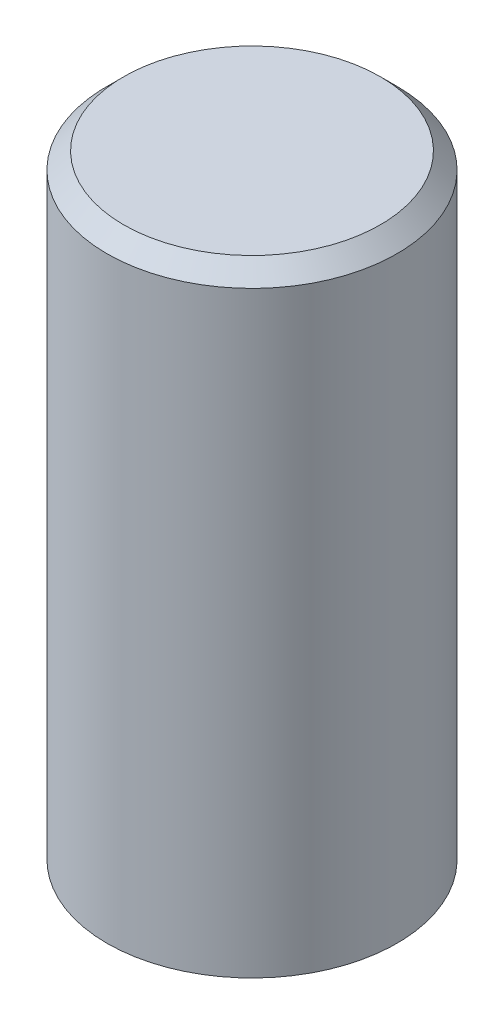
ISO-10303-21;
HEADER;
FILE_DESCRIPTION(('STEP AP214'),'2;1');
FILE_NAME('part.step','',(''),(''),'','','');
FILE_SCHEMA(('AUTOMOTIVE_DESIGN { 1 0 10303 214 1 1 1 1 }'));
ENDSEC;
DATA;
#1=APPLICATION_CONTEXT('core data for automotive mechanical design processes');
#2=APPLICATION_PROTOCOL_DEFINITION('international standard','automotive_design',2000,#1);
#3=PRODUCT_CONTEXT('',#1,'mechanical');
#4=PRODUCT('Part','Part','',(#3));
#5=PRODUCT_RELATED_PRODUCT_CATEGORY('part','',(#4));
#6=PRODUCT_DEFINITION_FORMATION('','',#4);
#7=PRODUCT_DEFINITION_CONTEXT('part definition',#1,'design');
#8=PRODUCT_DEFINITION('design','',#6,#7);
#9=PRODUCT_DEFINITION_SHAPE('','',#8);
#10=(LENGTH_UNIT() NAMED_UNIT(*) SI_UNIT(.MILLI.,.METRE.));
#11=(NAMED_UNIT(*) PLANE_ANGLE_UNIT() SI_UNIT($,.RADIAN.));
#12=(NAMED_UNIT(*) SI_UNIT($,.STERADIAN.) SOLID_ANGLE_UNIT());
#13=UNCERTAINTY_MEASURE_WITH_UNIT(LENGTH_MEASURE(1.E-05),#10,'distance_accuracy_value','');
#14=(GEOMETRIC_REPRESENTATION_CONTEXT(3) GLOBAL_UNCERTAINTY_ASSIGNED_CONTEXT((#13)) GLOBAL_UNIT_ASSIGNED_CONTEXT((#10,
#11,#12)) REPRESENTATION_CONTEXT('',''));
#15=CARTESIAN_POINT('',(0.,0.,0.));
#16=DIRECTION('',(0.,0.,1.));
#17=DIRECTION('',(1.,0.,0.));
#18=AXIS2_PLACEMENT_3D('',#15,#16,#17);
#19=CARTESIAN_POINT('',(0.,25.4,0.));
#20=DIRECTION('',(0.,-1.,0.));
#21=DIRECTION('',(0.,0.,1.));
#22=AXIS2_PLACEMENT_3D('',#19,#20,#21);
#23=CYLINDRICAL_SURFACE('',#22,6.);
#24=CARTESIAN_POINT('',(0.,24.7095,0.));
#25=DIRECTION('',(0.,1.,0.));
#26=DIRECTION('',(0.,0.,1.));
#27=AXIS2_PLACEMENT_3D('',#24,#25,#26);
#28=CIRCLE('',#27,6.);
#29=CARTESIAN_POINT('',(0.,24.7095,6.));
#30=VERTEX_POINT('',#29);
#31=EDGE_CURVE('E51',#30,#30,#28,.T.);
#32=ORIENTED_EDGE('',*,*,#31,.F.);
#33=EDGE_LOOP('',(#32));
#34=FACE_BOUND('',#33,.T.);
#35=CARTESIAN_POINT('',(0.,0.,0.));
#36=DIRECTION('',(0.,-1.,0.));
#37=DIRECTION('',(0.,0.,-1.));
#38=AXIS2_PLACEMENT_3D('',#35,#36,#37);
#39=CIRCLE('',#38,6.);
#40=CARTESIAN_POINT('',(0.,0.,-6.));
#41=VERTEX_POINT('',#40);
#42=EDGE_CURVE('E10',#41,#41,#39,.T.);
#43=ORIENTED_EDGE('',*,*,#42,.F.);
#44=EDGE_LOOP('',(#43));
#45=FACE_BOUND('',#44,.T.);
#46=ADVANCED_FACE('F45',(#34,#45),#23,.T.);
#47=CARTESIAN_POINT('',(0.,0.,0.));
#48=DIRECTION('',(0.,1.,0.));
#49=DIRECTION('',(0.,0.,-1.));
#50=AXIS2_PLACEMENT_3D('',#47,#48,#49);
#51=PLANE('',#50);
#52=ORIENTED_EDGE('',*,*,#42,.T.);
#53=EDGE_LOOP('',(#52));
#54=FACE_BOUND('',#53,.T.);
#55=ADVANCED_FACE('F66',(#54),#51,.F.);
#56=CARTESIAN_POINT('',(0.,25.4,0.));
#57=DIRECTION('',(0.,-1.,0.));
#58=DIRECTION('',(0.,0.,1.));
#59=AXIS2_PLACEMENT_3D('',#56,#57,#58);
#60=CONICAL_SURFACE('',#59,5.3095,0.785398163397455);
#61=ORIENTED_EDGE('',*,*,#31,.T.);
#62=EDGE_LOOP('',(#61));
#63=FACE_BOUND('',#62,.T.);
#64=CARTESIAN_POINT('',(0.,25.4,0.));
#65=DIRECTION('',(0.,1.,0.));
#66=DIRECTION('',(0.,0.,1.));
#67=AXIS2_PLACEMENT_3D('',#64,#65,#66);
#68=CIRCLE('',#67,5.3095);
#69=CARTESIAN_POINT('',(0.,25.4,5.3095));
#70=VERTEX_POINT('',#69);
#71=EDGE_CURVE('E55',#70,#70,#68,.T.);
#72=ORIENTED_EDGE('',*,*,#71,.F.);
#73=EDGE_LOOP('',(#72));
#74=FACE_BOUND('',#73,.T.);
#75=ADVANCED_FACE('F64',(#63,#74),#60,.T.);
#76=CARTESIAN_POINT('',(0.,25.4,0.));
#77=DIRECTION('',(0.,1.,0.));
#78=DIRECTION('',(0.,0.,-1.));
#79=AXIS2_PLACEMENT_3D('',#76,#77,#78);
#80=PLANE('',#79);
#81=ORIENTED_EDGE('',*,*,#71,.T.);
#82=EDGE_LOOP('',(#81));
#83=FACE_BOUND('',#82,.T.);
#84=ADVANCED_FACE('F62',(#83),#80,.T.);
#85=CLOSED_SHELL('',(#46,#55,#75,#84));
#86=MANIFOLD_SOLID_BREP('B2',#85);
#87=ADVANCED_BREP_SHAPE_REPRESENTATION('',(#18,#86),#14);
#88=SHAPE_DEFINITION_REPRESENTATION(#9,#87);
ENDSEC;
END-ISO-10303-21;
